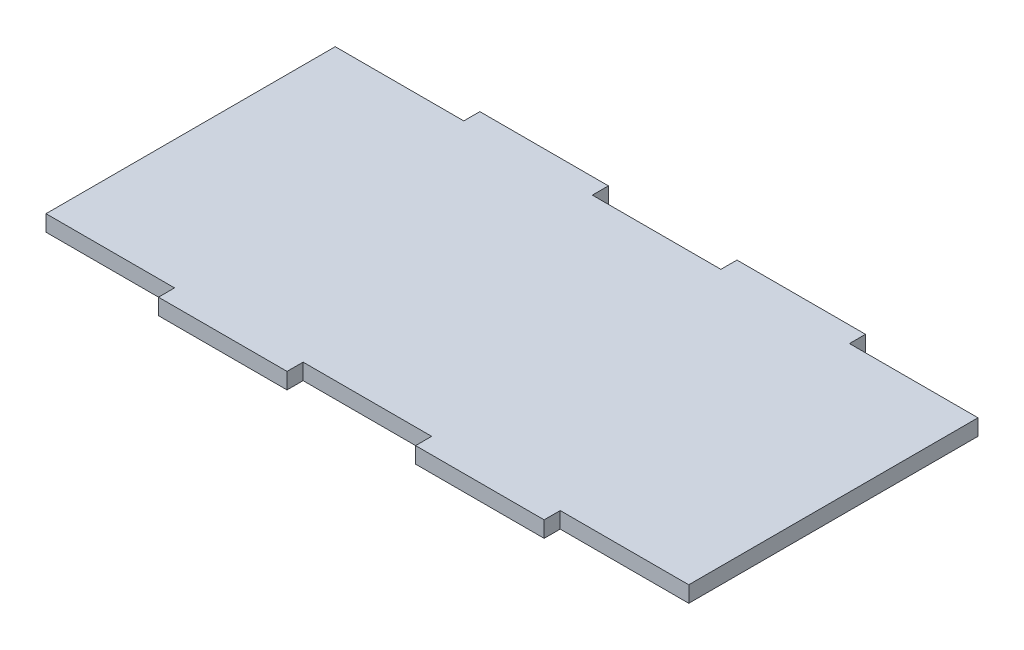
ISO-10303-21;
HEADER;
FILE_DESCRIPTION(('STEP AP214'),'2;1');
FILE_NAME('part.step','',(''),(''),'','','');
FILE_SCHEMA(('AUTOMOTIVE_DESIGN { 1 0 10303 214 1 1 1 1 }'));
ENDSEC;
DATA;
#1=APPLICATION_CONTEXT('core data for automotive mechanical design processes');
#2=APPLICATION_PROTOCOL_DEFINITION('international standard','automotive_design',2000,#1);
#3=PRODUCT_CONTEXT('',#1,'mechanical');
#4=PRODUCT('Part','Part','',(#3));
#5=PRODUCT_RELATED_PRODUCT_CATEGORY('part','',(#4));
#6=PRODUCT_DEFINITION_FORMATION('','',#4);
#7=PRODUCT_DEFINITION_CONTEXT('part definition',#1,'design');
#8=PRODUCT_DEFINITION('design','',#6,#7);
#9=PRODUCT_DEFINITION_SHAPE('','',#8);
#10=(LENGTH_UNIT() NAMED_UNIT(*) SI_UNIT(.MILLI.,.METRE.));
#11=(NAMED_UNIT(*) PLANE_ANGLE_UNIT() SI_UNIT($,.RADIAN.));
#12=(NAMED_UNIT(*) SI_UNIT($,.STERADIAN.) SOLID_ANGLE_UNIT());
#13=UNCERTAINTY_MEASURE_WITH_UNIT(LENGTH_MEASURE(1.E-05),#10,'distance_accuracy_value','');
#14=(GEOMETRIC_REPRESENTATION_CONTEXT(3) GLOBAL_UNCERTAINTY_ASSIGNED_CONTEXT((#13)) GLOBAL_UNIT_ASSIGNED_CONTEXT((#10,
#11,#12)) REPRESENTATION_CONTEXT('',''));
#15=CARTESIAN_POINT('',(0.,0.,0.));
#16=DIRECTION('',(0.,0.,1.));
#17=DIRECTION('',(1.,0.,0.));
#18=AXIS2_PLACEMENT_3D('',#15,#16,#17);
#19=CARTESIAN_POINT('',(0.,3.175,0.));
#20=DIRECTION('',(0.,0.,-1.));
#21=DIRECTION('',(-1.,0.,0.));
#22=AXIS2_PLACEMENT_3D('',#19,#20,#21);
#23=PLANE('',#22);
#24=DIRECTION('',(1.,0.,0.));
#25=VECTOR('',#24,1.);
#26=CARTESIAN_POINT('',(0.,0.,0.));
#27=LINE('',#26,#25);
#28=CARTESIAN_POINT('',(0.,0.,0.));
#29=VERTEX_POINT('',#28);
#30=CARTESIAN_POINT('',(25.4,0.,0.));
#31=VERTEX_POINT('',#30);
#32=EDGE_CURVE('E208',#29,#31,#27,.T.);
#33=ORIENTED_EDGE('',*,*,#32,.T.);
#34=DIRECTION('',(0.,-1.,0.));
#35=VECTOR('',#34,1.);
#36=CARTESIAN_POINT('',(25.4,3.175,0.));
#37=LINE('',#36,#35);
#38=CARTESIAN_POINT('',(25.4,3.175,0.));
#39=VERTEX_POINT('',#38);
#40=EDGE_CURVE('E43',#39,#31,#37,.T.);
#41=ORIENTED_EDGE('',*,*,#40,.F.);
#42=DIRECTION('',(1.,0.,0.));
#43=VECTOR('',#42,1.);
#44=CARTESIAN_POINT('',(0.,3.175,0.));
#45=LINE('',#44,#43);
#46=CARTESIAN_POINT('',(0.,3.175,0.));
#47=VERTEX_POINT('',#46);
#48=EDGE_CURVE('E132',#47,#39,#45,.T.);
#49=ORIENTED_EDGE('',*,*,#48,.F.);
#50=DIRECTION('',(0.,-1.,0.));
#51=VECTOR('',#50,1.);
#52=CARTESIAN_POINT('',(0.,3.175,0.));
#53=LINE('',#52,#51);
#54=EDGE_CURVE('E11',#47,#29,#53,.T.);
#55=ORIENTED_EDGE('',*,*,#54,.T.);
#56=EDGE_LOOP('',(#33,#41,#49,#55));
#57=FACE_BOUND('',#56,.T.);
#58=ADVANCED_FACE('F35',(#57),#23,.F.);
#59=CARTESIAN_POINT('',(25.4,3.175,3.17500000000006));
#60=DIRECTION('',(1.,0.,0.));
#61=DIRECTION('',(0.,0.,-1.));
#62=AXIS2_PLACEMENT_3D('',#59,#60,#61);
#63=PLANE('',#62);
#64=DIRECTION('',(0.,0.,1.));
#65=VECTOR('',#64,1.);
#66=CARTESIAN_POINT('',(25.4,0.,3.17500000000006));
#67=LINE('',#66,#65);
#68=CARTESIAN_POINT('',(25.4,0.,3.17500000000006));
#69=VERTEX_POINT('',#68);
#70=EDGE_CURVE('E210',#31,#69,#67,.T.);
#71=ORIENTED_EDGE('',*,*,#70,.T.);
#72=DIRECTION('',(0.,-1.,0.));
#73=VECTOR('',#72,1.);
#74=CARTESIAN_POINT('',(25.4,3.175,3.17500000000006));
#75=LINE('',#74,#73);
#76=CARTESIAN_POINT('',(25.4,3.175,3.17500000000006));
#77=VERTEX_POINT('',#76);
#78=EDGE_CURVE('E288',#77,#69,#75,.T.);
#79=ORIENTED_EDGE('',*,*,#78,.F.);
#80=DIRECTION('',(0.,0.,1.));
#81=VECTOR('',#80,1.);
#82=CARTESIAN_POINT('',(25.4,3.175,3.17500000000006));
#83=LINE('',#82,#81);
#84=EDGE_CURVE('E296',#39,#77,#83,.T.);
#85=ORIENTED_EDGE('',*,*,#84,.F.);
#86=ORIENTED_EDGE('',*,*,#40,.T.);
#87=EDGE_LOOP('',(#71,#79,#85,#86));
#88=FACE_BOUND('',#87,.T.);
#89=ADVANCED_FACE('F294',(#88),#63,.F.);
#90=CARTESIAN_POINT('',(50.8,3.175,3.17500000000005));
#91=DIRECTION('',(0.,0.,-1.));
#92=DIRECTION('',(-1.,0.,0.));
#93=AXIS2_PLACEMENT_3D('',#90,#91,#92);
#94=PLANE('',#93);
#95=DIRECTION('',(1.,0.,0.));
#96=VECTOR('',#95,1.);
#97=CARTESIAN_POINT('',(50.8,0.,3.17500000000005));
#98=LINE('',#97,#96);
#99=CARTESIAN_POINT('',(50.8,0.,3.17500000000005));
#100=VERTEX_POINT('',#99);
#101=EDGE_CURVE('E212',#69,#100,#98,.T.);
#102=ORIENTED_EDGE('',*,*,#101,.T.);
#103=DIRECTION('',(0.,-1.,0.));
#104=VECTOR('',#103,1.);
#105=CARTESIAN_POINT('',(50.8,3.175,3.17500000000005));
#106=LINE('',#105,#104);
#107=CARTESIAN_POINT('',(50.8,3.175,3.17500000000005));
#108=VERTEX_POINT('',#107);
#109=EDGE_CURVE('E285',#108,#100,#106,.T.);
#110=ORIENTED_EDGE('',*,*,#109,.F.);
#111=DIRECTION('',(1.,0.,0.));
#112=VECTOR('',#111,1.);
#113=CARTESIAN_POINT('',(50.8,3.175,3.17500000000005));
#114=LINE('',#113,#112);
#115=EDGE_CURVE('E312',#77,#108,#114,.T.);
#116=ORIENTED_EDGE('',*,*,#115,.F.);
#117=ORIENTED_EDGE('',*,*,#78,.T.);
#118=EDGE_LOOP('',(#102,#110,#116,#117));
#119=FACE_BOUND('',#118,.T.);
#120=ADVANCED_FACE('F303',(#119),#94,.F.);
#121=CARTESIAN_POINT('',(50.8,3.175,0.));
#122=DIRECTION('',(-1.,0.,0.));
#123=DIRECTION('',(0.,0.,1.));
#124=AXIS2_PLACEMENT_3D('',#121,#122,#123);
#125=PLANE('',#124);
#126=DIRECTION('',(0.,0.,-1.));
#127=VECTOR('',#126,1.);
#128=CARTESIAN_POINT('',(50.8,0.,0.));
#129=LINE('',#128,#127);
#130=CARTESIAN_POINT('',(50.8,0.,0.));
#131=VERTEX_POINT('',#130);
#132=EDGE_CURVE('E214',#100,#131,#129,.T.);
#133=ORIENTED_EDGE('',*,*,#132,.T.);
#134=DIRECTION('',(0.,-1.,0.));
#135=VECTOR('',#134,1.);
#136=CARTESIAN_POINT('',(50.8,3.175,0.));
#137=LINE('',#136,#135);
#138=CARTESIAN_POINT('',(50.8,3.175,0.));
#139=VERTEX_POINT('',#138);
#140=EDGE_CURVE('E282',#139,#131,#137,.T.);
#141=ORIENTED_EDGE('',*,*,#140,.F.);
#142=DIRECTION('',(0.,0.,-1.));
#143=VECTOR('',#142,1.);
#144=CARTESIAN_POINT('',(50.8,3.175,0.));
#145=LINE('',#144,#143);
#146=EDGE_CURVE('E309',#108,#139,#145,.T.);
#147=ORIENTED_EDGE('',*,*,#146,.F.);
#148=ORIENTED_EDGE('',*,*,#109,.T.);
#149=EDGE_LOOP('',(#133,#141,#147,#148));
#150=FACE_BOUND('',#149,.T.);
#151=ADVANCED_FACE('F307',(#150),#125,.F.);
#152=CARTESIAN_POINT('',(50.8,3.175,0.));
#153=DIRECTION('',(0.,0.,-1.));
#154=DIRECTION('',(-1.,0.,0.));
#155=AXIS2_PLACEMENT_3D('',#152,#153,#154);
#156=PLANE('',#155);
#157=DIRECTION('',(1.,0.,0.));
#158=VECTOR('',#157,1.);
#159=CARTESIAN_POINT('',(50.8,0.,0.));
#160=LINE('',#159,#158);
#161=CARTESIAN_POINT('',(76.2,0.,0.));
#162=VERTEX_POINT('',#161);
#163=EDGE_CURVE('E216',#131,#162,#160,.T.);
#164=ORIENTED_EDGE('',*,*,#163,.T.);
#165=DIRECTION('',(0.,-1.,0.));
#166=VECTOR('',#165,1.);
#167=CARTESIAN_POINT('',(76.2,3.175,0.));
#168=LINE('',#167,#166);
#169=CARTESIAN_POINT('',(76.2,3.175,0.));
#170=VERTEX_POINT('',#169);
#171=EDGE_CURVE('E279',#170,#162,#168,.T.);
#172=ORIENTED_EDGE('',*,*,#171,.F.);
#173=DIRECTION('',(1.,0.,0.));
#174=VECTOR('',#173,1.);
#175=CARTESIAN_POINT('',(50.8,3.175,0.));
#176=LINE('',#175,#174);
#177=EDGE_CURVE('E311',#139,#170,#176,.T.);
#178=ORIENTED_EDGE('',*,*,#177,.F.);
#179=ORIENTED_EDGE('',*,*,#140,.T.);
#180=EDGE_LOOP('',(#164,#172,#178,#179));
#181=FACE_BOUND('',#180,.T.);
#182=ADVANCED_FACE('F362',(#181),#156,.F.);
#183=CARTESIAN_POINT('',(76.2,3.175,0.));
#184=DIRECTION('',(1.,0.,0.));
#185=DIRECTION('',(0.,0.,-1.));
#186=AXIS2_PLACEMENT_3D('',#183,#184,#185);
#187=PLANE('',#186);
#188=DIRECTION('',(0.,0.,1.));
#189=VECTOR('',#188,1.);
#190=CARTESIAN_POINT('',(76.2,0.,0.));
#191=LINE('',#190,#189);
#192=CARTESIAN_POINT('',(76.2,0.,3.17500000000005));
#193=VERTEX_POINT('',#192);
#194=EDGE_CURVE('E218',#162,#193,#191,.T.);
#195=ORIENTED_EDGE('',*,*,#194,.T.);
#196=DIRECTION('',(0.,-1.,0.));
#197=VECTOR('',#196,1.);
#198=CARTESIAN_POINT('',(76.2,3.175,3.17500000000005));
#199=LINE('',#198,#197);
#200=CARTESIAN_POINT('',(76.2,3.175,3.17500000000005));
#201=VERTEX_POINT('',#200);
#202=EDGE_CURVE('E276',#201,#193,#199,.T.);
#203=ORIENTED_EDGE('',*,*,#202,.F.);
#204=DIRECTION('',(0.,0.,1.));
#205=VECTOR('',#204,1.);
#206=CARTESIAN_POINT('',(76.2,3.175,0.));
#207=LINE('',#206,#205);
#208=EDGE_CURVE('E314',#170,#201,#207,.T.);
#209=ORIENTED_EDGE('',*,*,#208,.F.);
#210=ORIENTED_EDGE('',*,*,#171,.T.);
#211=EDGE_LOOP('',(#195,#203,#209,#210));
#212=FACE_BOUND('',#211,.T.);
#213=ADVANCED_FACE('F365',(#212),#187,.F.);
#214=CARTESIAN_POINT('',(76.2,3.175,3.17500000000005));
#215=DIRECTION('',(0.,0.,-1.));
#216=DIRECTION('',(-1.,0.,0.));
#217=AXIS2_PLACEMENT_3D('',#214,#215,#216);
#218=PLANE('',#217);
#219=DIRECTION('',(1.,0.,0.));
#220=VECTOR('',#219,1.);
#221=CARTESIAN_POINT('',(76.2,0.,3.17500000000005));
#222=LINE('',#221,#220);
#223=CARTESIAN_POINT('',(101.6,0.,3.17500000000005));
#224=VERTEX_POINT('',#223);
#225=EDGE_CURVE('E220',#193,#224,#222,.T.);
#226=ORIENTED_EDGE('',*,*,#225,.T.);
#227=DIRECTION('',(0.,-1.,0.));
#228=VECTOR('',#227,1.);
#229=CARTESIAN_POINT('',(101.6,3.175,3.17500000000005));
#230=LINE('',#229,#228);
#231=CARTESIAN_POINT('',(101.6,3.175,3.17500000000005));
#232=VERTEX_POINT('',#231);
#233=EDGE_CURVE('E273',#232,#224,#230,.T.);
#234=ORIENTED_EDGE('',*,*,#233,.F.);
#235=DIRECTION('',(1.,0.,0.));
#236=VECTOR('',#235,1.);
#237=CARTESIAN_POINT('',(76.2,3.175,3.17500000000005));
#238=LINE('',#237,#236);
#239=EDGE_CURVE('E320',#201,#232,#238,.T.);
#240=ORIENTED_EDGE('',*,*,#239,.F.);
#241=ORIENTED_EDGE('',*,*,#202,.T.);
#242=EDGE_LOOP('',(#226,#234,#240,#241));
#243=FACE_BOUND('',#242,.T.);
#244=ADVANCED_FACE('F369',(#243),#218,.F.);
#245=CARTESIAN_POINT('',(101.6,3.175,3.17500000000005));
#246=DIRECTION('',(-1.,0.,0.));
#247=DIRECTION('',(0.,0.,1.));
#248=AXIS2_PLACEMENT_3D('',#245,#246,#247);
#249=PLANE('',#248);
#250=DIRECTION('',(0.,0.,-1.));
#251=VECTOR('',#250,1.);
#252=CARTESIAN_POINT('',(101.6,0.,3.17500000000005));
#253=LINE('',#252,#251);
#254=CARTESIAN_POINT('',(101.6,0.,0.));
#255=VERTEX_POINT('',#254);
#256=EDGE_CURVE('E222',#224,#255,#253,.T.);
#257=ORIENTED_EDGE('',*,*,#256,.T.);
#258=DIRECTION('',(0.,-1.,0.));
#259=VECTOR('',#258,1.);
#260=CARTESIAN_POINT('',(101.6,3.175,0.));
#261=LINE('',#260,#259);
#262=CARTESIAN_POINT('',(101.6,3.175,0.));
#263=VERTEX_POINT('',#262);
#264=EDGE_CURVE('E270',#263,#255,#261,.T.);
#265=ORIENTED_EDGE('',*,*,#264,.F.);
#266=DIRECTION('',(0.,0.,-1.));
#267=VECTOR('',#266,1.);
#268=CARTESIAN_POINT('',(101.6,3.175,3.17500000000005));
#269=LINE('',#268,#267);
#270=EDGE_CURVE('E322',#232,#263,#269,.T.);
#271=ORIENTED_EDGE('',*,*,#270,.F.);
#272=ORIENTED_EDGE('',*,*,#233,.T.);
#273=EDGE_LOOP('',(#257,#265,#271,#272));
#274=FACE_BOUND('',#273,.T.);
#275=ADVANCED_FACE('F373',(#274),#249,.F.);
#276=CARTESIAN_POINT('',(101.6,3.175,0.));
#277=DIRECTION('',(0.,0.,-1.));
#278=DIRECTION('',(-1.,0.,0.));
#279=AXIS2_PLACEMENT_3D('',#276,#277,#278);
#280=PLANE('',#279);
#281=DIRECTION('',(1.,0.,0.));
#282=VECTOR('',#281,1.);
#283=CARTESIAN_POINT('',(101.6,0.,0.));
#284=LINE('',#283,#282);
#285=CARTESIAN_POINT('',(127.,0.,0.));
#286=VERTEX_POINT('',#285);
#287=EDGE_CURVE('E224',#255,#286,#284,.T.);
#288=ORIENTED_EDGE('',*,*,#287,.T.);
#289=DIRECTION('',(0.,-1.,0.));
#290=VECTOR('',#289,1.);
#291=CARTESIAN_POINT('',(127.,3.175,0.));
#292=LINE('',#291,#290);
#293=CARTESIAN_POINT('',(127.,3.175,0.));
#294=VERTEX_POINT('',#293);
#295=EDGE_CURVE('E267',#294,#286,#292,.T.);
#296=ORIENTED_EDGE('',*,*,#295,.F.);
#297=DIRECTION('',(1.,0.,0.));
#298=VECTOR('',#297,1.);
#299=CARTESIAN_POINT('',(101.6,3.175,0.));
#300=LINE('',#299,#298);
#301=EDGE_CURVE('E324',#263,#294,#300,.T.);
#302=ORIENTED_EDGE('',*,*,#301,.F.);
#303=ORIENTED_EDGE('',*,*,#264,.T.);
#304=EDGE_LOOP('',(#288,#296,#302,#303));
#305=FACE_BOUND('',#304,.T.);
#306=ADVANCED_FACE('F377',(#305),#280,.F.);
#307=CARTESIAN_POINT('',(127.,3.175,-41.275));
#308=DIRECTION('',(-1.,0.,0.));
#309=DIRECTION('',(0.,0.,1.));
#310=AXIS2_PLACEMENT_3D('',#307,#308,#309);
#311=PLANE('',#310);
#312=DIRECTION('',(0.,0.,-1.));
#313=VECTOR('',#312,1.);
#314=CARTESIAN_POINT('',(127.,0.,-41.275));
#315=LINE('',#314,#313);
#316=CARTESIAN_POINT('',(127.,0.,-57.15));
#317=VERTEX_POINT('',#316);
#318=EDGE_CURVE('E227',#286,#317,#315,.T.);
#319=ORIENTED_EDGE('',*,*,#318,.T.);
#320=DIRECTION('',(0.,-1.,0.));
#321=VECTOR('',#320,1.);
#322=CARTESIAN_POINT('',(127.,3.175,-57.15));
#323=LINE('',#322,#321);
#324=CARTESIAN_POINT('',(127.,3.175,-57.15));
#325=VERTEX_POINT('',#324);
#326=EDGE_CURVE('E264',#325,#317,#323,.T.);
#327=ORIENTED_EDGE('',*,*,#326,.F.);
#328=DIRECTION('',(0.,0.,-1.));
#329=VECTOR('',#328,1.);
#330=CARTESIAN_POINT('',(127.,3.175,0.));
#331=LINE('',#330,#329);
#332=EDGE_CURVE('E326',#294,#325,#331,.T.);
#333=ORIENTED_EDGE('',*,*,#332,.F.);
#334=ORIENTED_EDGE('',*,*,#295,.T.);
#335=EDGE_LOOP('',(#319,#327,#333,#334));
#336=FACE_BOUND('',#335,.T.);
#337=ADVANCED_FACE('F381',(#336),#311,.F.);
#338=CARTESIAN_POINT('',(101.6,3.175,-57.15));
#339=DIRECTION('',(0.,0.,1.));
#340=DIRECTION('',(1.,0.,0.));
#341=AXIS2_PLACEMENT_3D('',#338,#339,#340);
#342=PLANE('',#341);
#343=DIRECTION('',(-1.,0.,0.));
#344=VECTOR('',#343,1.);
#345=CARTESIAN_POINT('',(101.6,0.,-57.15));
#346=LINE('',#345,#344);
#347=CARTESIAN_POINT('',(101.6,0.,-57.15));
#348=VERTEX_POINT('',#347);
#349=EDGE_CURVE('E229',#317,#348,#346,.T.);
#350=ORIENTED_EDGE('',*,*,#349,.T.);
#351=DIRECTION('',(0.,-1.,0.));
#352=VECTOR('',#351,1.);
#353=CARTESIAN_POINT('',(101.6,3.175,-57.15));
#354=LINE('',#353,#352);
#355=CARTESIAN_POINT('',(101.6,3.175,-57.15));
#356=VERTEX_POINT('',#355);
#357=EDGE_CURVE('E261',#356,#348,#354,.T.);
#358=ORIENTED_EDGE('',*,*,#357,.F.);
#359=DIRECTION('',(-1.,0.,0.));
#360=VECTOR('',#359,1.);
#361=CARTESIAN_POINT('',(101.6,3.175,-57.15));
#362=LINE('',#361,#360);
#363=EDGE_CURVE('E328',#325,#356,#362,.T.);
#364=ORIENTED_EDGE('',*,*,#363,.F.);
#365=ORIENTED_EDGE('',*,*,#326,.T.);
#366=EDGE_LOOP('',(#350,#358,#364,#365));
#367=FACE_BOUND('',#366,.T.);
#368=ADVANCED_FACE('F385',(#367),#342,.F.);
#369=CARTESIAN_POINT('',(101.6,3.175,-60.325));
#370=DIRECTION('',(-1.,0.,0.));
#371=DIRECTION('',(0.,0.,1.));
#372=AXIS2_PLACEMENT_3D('',#369,#370,#371);
#373=PLANE('',#372);
#374=DIRECTION('',(0.,0.,-1.));
#375=VECTOR('',#374,1.);
#376=CARTESIAN_POINT('',(101.6,0.,-60.325));
#377=LINE('',#376,#375);
#378=CARTESIAN_POINT('',(101.6,0.,-60.325));
#379=VERTEX_POINT('',#378);
#380=EDGE_CURVE('E231',#348,#379,#377,.T.);
#381=ORIENTED_EDGE('',*,*,#380,.T.);
#382=DIRECTION('',(0.,-1.,0.));
#383=VECTOR('',#382,1.);
#384=CARTESIAN_POINT('',(101.6,3.175,-60.325));
#385=LINE('',#384,#383);
#386=CARTESIAN_POINT('',(101.6,3.175,-60.325));
#387=VERTEX_POINT('',#386);
#388=EDGE_CURVE('E258',#387,#379,#385,.T.);
#389=ORIENTED_EDGE('',*,*,#388,.F.);
#390=DIRECTION('',(0.,0.,-1.));
#391=VECTOR('',#390,1.);
#392=CARTESIAN_POINT('',(101.6,3.175,-60.325));
#393=LINE('',#392,#391);
#394=EDGE_CURVE('E330',#356,#387,#393,.T.);
#395=ORIENTED_EDGE('',*,*,#394,.F.);
#396=ORIENTED_EDGE('',*,*,#357,.T.);
#397=EDGE_LOOP('',(#381,#389,#395,#396));
#398=FACE_BOUND('',#397,.T.);
#399=ADVANCED_FACE('F389',(#398),#373,.F.);
#400=CARTESIAN_POINT('',(76.2,3.175,-60.325));
#401=DIRECTION('',(0.,0.,1.));
#402=DIRECTION('',(1.,0.,0.));
#403=AXIS2_PLACEMENT_3D('',#400,#401,#402);
#404=PLANE('',#403);
#405=DIRECTION('',(-1.,0.,0.));
#406=VECTOR('',#405,1.);
#407=CARTESIAN_POINT('',(76.2,0.,-60.325));
#408=LINE('',#407,#406);
#409=CARTESIAN_POINT('',(76.2,0.,-60.325));
#410=VERTEX_POINT('',#409);
#411=EDGE_CURVE('E233',#379,#410,#408,.T.);
#412=ORIENTED_EDGE('',*,*,#411,.T.);
#413=DIRECTION('',(0.,-1.,0.));
#414=VECTOR('',#413,1.);
#415=CARTESIAN_POINT('',(76.2,3.175,-60.325));
#416=LINE('',#415,#414);
#417=CARTESIAN_POINT('',(76.2,3.175,-60.325));
#418=VERTEX_POINT('',#417);
#419=EDGE_CURVE('E255',#418,#410,#416,.T.);
#420=ORIENTED_EDGE('',*,*,#419,.F.);
#421=DIRECTION('',(-1.,0.,0.));
#422=VECTOR('',#421,1.);
#423=CARTESIAN_POINT('',(76.2,3.175,-60.325));
#424=LINE('',#423,#422);
#425=EDGE_CURVE('E332',#387,#418,#424,.T.);
#426=ORIENTED_EDGE('',*,*,#425,.F.);
#427=ORIENTED_EDGE('',*,*,#388,.T.);
#428=EDGE_LOOP('',(#412,#420,#426,#427));
#429=FACE_BOUND('',#428,.T.);
#430=ADVANCED_FACE('F393',(#429),#404,.F.);
#431=CARTESIAN_POINT('',(76.2,3.175,-57.15));
#432=DIRECTION('',(1.,0.,0.));
#433=DIRECTION('',(0.,0.,-1.));
#434=AXIS2_PLACEMENT_3D('',#431,#432,#433);
#435=PLANE('',#434);
#436=DIRECTION('',(0.,0.,1.));
#437=VECTOR('',#436,1.);
#438=CARTESIAN_POINT('',(76.2,0.,-57.15));
#439=LINE('',#438,#437);
#440=CARTESIAN_POINT('',(76.2,0.,-57.15));
#441=VERTEX_POINT('',#440);
#442=EDGE_CURVE('E235',#410,#441,#439,.T.);
#443=ORIENTED_EDGE('',*,*,#442,.T.);
#444=DIRECTION('',(0.,-1.,0.));
#445=VECTOR('',#444,1.);
#446=CARTESIAN_POINT('',(76.2,3.175,-57.15));
#447=LINE('',#446,#445);
#448=CARTESIAN_POINT('',(76.2,3.175,-57.15));
#449=VERTEX_POINT('',#448);
#450=EDGE_CURVE('E252',#449,#441,#447,.T.);
#451=ORIENTED_EDGE('',*,*,#450,.F.);
#452=DIRECTION('',(0.,0.,1.));
#453=VECTOR('',#452,1.);
#454=CARTESIAN_POINT('',(76.2,3.175,-57.15));
#455=LINE('',#454,#453);
#456=EDGE_CURVE('E334',#418,#449,#455,.T.);
#457=ORIENTED_EDGE('',*,*,#456,.F.);
#458=ORIENTED_EDGE('',*,*,#419,.T.);
#459=EDGE_LOOP('',(#443,#451,#457,#458));
#460=FACE_BOUND('',#459,.T.);
#461=ADVANCED_FACE('F397',(#460),#435,.F.);
#462=CARTESIAN_POINT('',(50.8,3.175,-57.15));
#463=DIRECTION('',(0.,0.,1.));
#464=DIRECTION('',(1.,0.,0.));
#465=AXIS2_PLACEMENT_3D('',#462,#463,#464);
#466=PLANE('',#465);
#467=DIRECTION('',(-1.,0.,0.));
#468=VECTOR('',#467,1.);
#469=CARTESIAN_POINT('',(50.8,0.,-57.15));
#470=LINE('',#469,#468);
#471=CARTESIAN_POINT('',(50.8,0.,-57.15));
#472=VERTEX_POINT('',#471);
#473=EDGE_CURVE('E237',#441,#472,#470,.T.);
#474=ORIENTED_EDGE('',*,*,#473,.T.);
#475=DIRECTION('',(0.,-1.,0.));
#476=VECTOR('',#475,1.);
#477=CARTESIAN_POINT('',(50.8,3.175,-57.15));
#478=LINE('',#477,#476);
#479=CARTESIAN_POINT('',(50.8,3.175,-57.15));
#480=VERTEX_POINT('',#479);
#481=EDGE_CURVE('E249',#480,#472,#478,.T.);
#482=ORIENTED_EDGE('',*,*,#481,.F.);
#483=DIRECTION('',(-1.,0.,0.));
#484=VECTOR('',#483,1.);
#485=CARTESIAN_POINT('',(50.8,3.175,-57.15));
#486=LINE('',#485,#484);
#487=EDGE_CURVE('E336',#449,#480,#486,.T.);
#488=ORIENTED_EDGE('',*,*,#487,.F.);
#489=ORIENTED_EDGE('',*,*,#450,.T.);
#490=EDGE_LOOP('',(#474,#482,#488,#489));
#491=FACE_BOUND('',#490,.T.);
#492=ADVANCED_FACE('F342',(#491),#466,.F.);
#493=CARTESIAN_POINT('',(50.8,3.175,-57.15));
#494=DIRECTION('',(-1.,0.,0.));
#495=DIRECTION('',(0.,0.,1.));
#496=AXIS2_PLACEMENT_3D('',#493,#494,#495);
#497=PLANE('',#496);
#498=DIRECTION('',(0.,0.,-1.));
#499=VECTOR('',#498,1.);
#500=CARTESIAN_POINT('',(50.8,0.,-57.15));
#501=LINE('',#500,#499);
#502=CARTESIAN_POINT('',(50.8,0.,-60.325));
#503=VERTEX_POINT('',#502);
#504=EDGE_CURVE('E239',#472,#503,#501,.T.);
#505=ORIENTED_EDGE('',*,*,#504,.T.);
#506=DIRECTION('',(0.,-1.,0.));
#507=VECTOR('',#506,1.);
#508=CARTESIAN_POINT('',(50.8,3.175,-60.325));
#509=LINE('',#508,#507);
#510=CARTESIAN_POINT('',(50.8,3.175,-60.325));
#511=VERTEX_POINT('',#510);
#512=EDGE_CURVE('E197',#511,#503,#509,.T.);
#513=ORIENTED_EDGE('',*,*,#512,.F.);
#514=DIRECTION('',(0.,0.,-1.));
#515=VECTOR('',#514,1.);
#516=CARTESIAN_POINT('',(50.8,3.175,-57.15));
#517=LINE('',#516,#515);
#518=EDGE_CURVE('E188',#480,#511,#517,.T.);
#519=ORIENTED_EDGE('',*,*,#518,.F.);
#520=ORIENTED_EDGE('',*,*,#481,.T.);
#521=EDGE_LOOP('',(#505,#513,#519,#520));
#522=FACE_BOUND('',#521,.T.);
#523=ADVANCED_FACE('F346',(#522),#497,.F.);
#524=CARTESIAN_POINT('',(50.8,3.175,-60.325));
#525=DIRECTION('',(0.,0.,1.));
#526=DIRECTION('',(1.,0.,0.));
#527=AXIS2_PLACEMENT_3D('',#524,#525,#526);
#528=PLANE('',#527);
#529=DIRECTION('',(-1.,0.,0.));
#530=VECTOR('',#529,1.);
#531=CARTESIAN_POINT('',(50.8,0.,-60.325));
#532=LINE('',#531,#530);
#533=CARTESIAN_POINT('',(25.4,0.,-60.325));
#534=VERTEX_POINT('',#533);
#535=EDGE_CURVE('E196',#503,#534,#532,.T.);
#536=ORIENTED_EDGE('',*,*,#535,.T.);
#537=DIRECTION('',(0.,-1.,0.));
#538=VECTOR('',#537,1.);
#539=CARTESIAN_POINT('',(25.4,3.175,-60.325));
#540=LINE('',#539,#538);
#541=CARTESIAN_POINT('',(25.4,3.175,-60.325));
#542=VERTEX_POINT('',#541);
#543=EDGE_CURVE('E193',#542,#534,#540,.T.);
#544=ORIENTED_EDGE('',*,*,#543,.F.);
#545=DIRECTION('',(-1.,0.,0.));
#546=VECTOR('',#545,1.);
#547=CARTESIAN_POINT('',(50.8,3.175,-60.325));
#548=LINE('',#547,#546);
#549=EDGE_CURVE('E182',#511,#542,#548,.T.);
#550=ORIENTED_EDGE('',*,*,#549,.F.);
#551=ORIENTED_EDGE('',*,*,#512,.T.);
#552=EDGE_LOOP('',(#536,#544,#550,#551));
#553=FACE_BOUND('',#552,.T.);
#554=ADVANCED_FACE('F194',(#553),#528,.F.);
#555=CARTESIAN_POINT('',(25.4,3.175,-60.325));
#556=DIRECTION('',(1.,0.,0.));
#557=DIRECTION('',(0.,0.,-1.));
#558=AXIS2_PLACEMENT_3D('',#555,#556,#557);
#559=PLANE('',#558);
#560=DIRECTION('',(0.,0.,1.));
#561=VECTOR('',#560,1.);
#562=CARTESIAN_POINT('',(25.4,0.,-60.325));
#563=LINE('',#562,#561);
#564=CARTESIAN_POINT('',(25.4,0.,-57.15));
#565=VERTEX_POINT('',#564);
#566=EDGE_CURVE('E117',#534,#565,#563,.T.);
#567=ORIENTED_EDGE('',*,*,#566,.T.);
#568=DIRECTION('',(0.,-1.,0.));
#569=VECTOR('',#568,1.);
#570=CARTESIAN_POINT('',(25.4,3.175,-57.15));
#571=LINE('',#570,#569);
#572=CARTESIAN_POINT('',(25.4,3.175,-57.15));
#573=VERTEX_POINT('',#572);
#574=EDGE_CURVE('E198',#573,#565,#571,.T.);
#575=ORIENTED_EDGE('',*,*,#574,.F.);
#576=DIRECTION('',(0.,0.,1.));
#577=VECTOR('',#576,1.);
#578=CARTESIAN_POINT('',(25.4,3.175,-60.325));
#579=LINE('',#578,#577);
#580=EDGE_CURVE('E186',#542,#573,#579,.T.);
#581=ORIENTED_EDGE('',*,*,#580,.F.);
#582=ORIENTED_EDGE('',*,*,#543,.T.);
#583=EDGE_LOOP('',(#567,#575,#581,#582));
#584=FACE_BOUND('',#583,.T.);
#585=ADVANCED_FACE('F200',(#584),#559,.F.);
#586=CARTESIAN_POINT('',(0.,3.175,-57.15));
#587=DIRECTION('',(0.,0.,1.));
#588=DIRECTION('',(1.,0.,0.));
#589=AXIS2_PLACEMENT_3D('',#586,#587,#588);
#590=PLANE('',#589);
#591=DIRECTION('',(-1.,0.,0.));
#592=VECTOR('',#591,1.);
#593=CARTESIAN_POINT('',(0.,0.,-57.15));
#594=LINE('',#593,#592);
#595=CARTESIAN_POINT('',(0.,0.,-57.15));
#596=VERTEX_POINT('',#595);
#597=EDGE_CURVE('E243',#565,#596,#594,.T.);
#598=ORIENTED_EDGE('',*,*,#597,.T.);
#599=DIRECTION('',(0.,-1.,0.));
#600=VECTOR('',#599,1.);
#601=CARTESIAN_POINT('',(0.,3.175,-57.15));
#602=LINE('',#601,#600);
#603=CARTESIAN_POINT('',(0.,3.175,-57.15));
#604=VERTEX_POINT('',#603);
#605=EDGE_CURVE('E204',#604,#596,#602,.T.);
#606=ORIENTED_EDGE('',*,*,#605,.F.);
#607=DIRECTION('',(-1.,0.,0.));
#608=VECTOR('',#607,1.);
#609=CARTESIAN_POINT('',(0.,3.175,-57.15));
#610=LINE('',#609,#608);
#611=EDGE_CURVE('E202',#573,#604,#610,.T.);
#612=ORIENTED_EDGE('',*,*,#611,.F.);
#613=ORIENTED_EDGE('',*,*,#574,.T.);
#614=EDGE_LOOP('',(#598,#606,#612,#613));
#615=FACE_BOUND('',#614,.T.);
#616=ADVANCED_FACE('F349',(#615),#590,.F.);
#617=CARTESIAN_POINT('',(0.,3.175,-41.275));
#618=DIRECTION('',(1.,0.,0.));
#619=DIRECTION('',(0.,0.,-1.));
#620=AXIS2_PLACEMENT_3D('',#617,#618,#619);
#621=PLANE('',#620);
#622=DIRECTION('',(0.,0.,1.));
#623=VECTOR('',#622,1.);
#624=CARTESIAN_POINT('',(0.,0.,-41.275));
#625=LINE('',#624,#623);
#626=EDGE_CURVE('E124',#596,#29,#625,.T.);
#627=ORIENTED_EDGE('',*,*,#626,.T.);
#628=ORIENTED_EDGE('',*,*,#54,.F.);
#629=DIRECTION('',(0.,0.,1.));
#630=VECTOR('',#629,1.);
#631=CARTESIAN_POINT('',(0.,3.175,0.));
#632=LINE('',#631,#630);
#633=EDGE_CURVE('E51',#604,#47,#632,.T.);
#634=ORIENTED_EDGE('',*,*,#633,.F.);
#635=ORIENTED_EDGE('',*,*,#605,.T.);
#636=EDGE_LOOP('',(#627,#628,#634,#635));
#637=FACE_BOUND('',#636,.T.);
#638=ADVANCED_FACE('F350',(#637),#621,.F.);
#639=CARTESIAN_POINT('',(0.,3.175,0.));
#640=DIRECTION('',(0.,-1.,0.));
#641=DIRECTION('',(0.,0.,-1.));
#642=AXIS2_PLACEMENT_3D('',#639,#640,#641);
#643=PLANE('',#642);
#644=ORIENTED_EDGE('',*,*,#633,.T.);
#645=ORIENTED_EDGE('',*,*,#48,.T.);
#646=ORIENTED_EDGE('',*,*,#84,.T.);
#647=ORIENTED_EDGE('',*,*,#115,.T.);
#648=ORIENTED_EDGE('',*,*,#146,.T.);
#649=ORIENTED_EDGE('',*,*,#177,.T.);
#650=ORIENTED_EDGE('',*,*,#208,.T.);
#651=ORIENTED_EDGE('',*,*,#239,.T.);
#652=ORIENTED_EDGE('',*,*,#270,.T.);
#653=ORIENTED_EDGE('',*,*,#301,.T.);
#654=ORIENTED_EDGE('',*,*,#332,.T.);
#655=ORIENTED_EDGE('',*,*,#363,.T.);
#656=ORIENTED_EDGE('',*,*,#394,.T.);
#657=ORIENTED_EDGE('',*,*,#425,.T.);
#658=ORIENTED_EDGE('',*,*,#456,.T.);
#659=ORIENTED_EDGE('',*,*,#487,.T.);
#660=ORIENTED_EDGE('',*,*,#518,.T.);
#661=ORIENTED_EDGE('',*,*,#549,.T.);
#662=ORIENTED_EDGE('',*,*,#580,.T.);
#663=ORIENTED_EDGE('',*,*,#611,.T.);
#664=EDGE_LOOP('',(#644,#645,#646,#647,#648,#649,#650,#651,#652,#653,#654,#655,#656,#657,#658,
#659,#660,#661,#662,#663));
#665=FACE_BOUND('',#664,.T.);
#666=ADVANCED_FACE('F184',(#665),#643,.F.);
#667=CARTESIAN_POINT('',(0.,0.,0.));
#668=DIRECTION('',(0.,-1.,0.));
#669=DIRECTION('',(0.,0.,-1.));
#670=AXIS2_PLACEMENT_3D('',#667,#668,#669);
#671=PLANE('',#670);
#672=ORIENTED_EDGE('',*,*,#32,.F.);
#673=ORIENTED_EDGE('',*,*,#626,.F.);
#674=ORIENTED_EDGE('',*,*,#597,.F.);
#675=ORIENTED_EDGE('',*,*,#566,.F.);
#676=ORIENTED_EDGE('',*,*,#535,.F.);
#677=ORIENTED_EDGE('',*,*,#504,.F.);
#678=ORIENTED_EDGE('',*,*,#473,.F.);
#679=ORIENTED_EDGE('',*,*,#442,.F.);
#680=ORIENTED_EDGE('',*,*,#411,.F.);
#681=ORIENTED_EDGE('',*,*,#380,.F.);
#682=ORIENTED_EDGE('',*,*,#349,.F.);
#683=ORIENTED_EDGE('',*,*,#318,.F.);
#684=ORIENTED_EDGE('',*,*,#287,.F.);
#685=ORIENTED_EDGE('',*,*,#256,.F.);
#686=ORIENTED_EDGE('',*,*,#225,.F.);
#687=ORIENTED_EDGE('',*,*,#194,.F.);
#688=ORIENTED_EDGE('',*,*,#163,.F.);
#689=ORIENTED_EDGE('',*,*,#132,.F.);
#690=ORIENTED_EDGE('',*,*,#101,.F.);
#691=ORIENTED_EDGE('',*,*,#70,.F.);
#692=EDGE_LOOP('',(#672,#673,#674,#675,#676,#677,#678,#679,#680,#681,#682,#683,#684,#685,#686,
#687,#688,#689,#690,#691));
#693=FACE_BOUND('',#692,.T.);
#694=ADVANCED_FACE('F298',(#693),#671,.T.);
#695=CLOSED_SHELL('',(#58,#89,#120,#151,#182,#213,#244,#275,#306,#337,#368,#399,#430,#461,#492,
#523,#554,#585,#616,#638,#666,#694));
#696=MANIFOLD_SOLID_BREP('B2',#695);
#697=ADVANCED_BREP_SHAPE_REPRESENTATION('',(#18,#696),#14);
#698=SHAPE_DEFINITION_REPRESENTATION(#9,#697);
ENDSEC;
END-ISO-10303-21;
